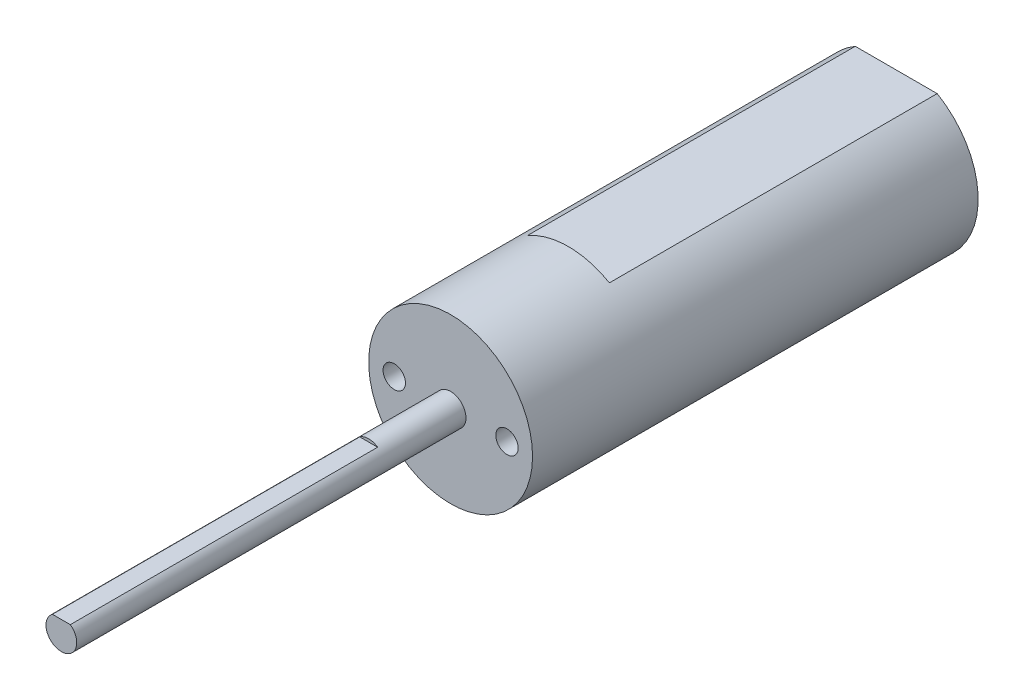
ISO-10303-21;
HEADER;
FILE_DESCRIPTION(('STEP AP214'),'2;1');
FILE_NAME('part.step','',(''),(''),'','','');
FILE_SCHEMA(('AUTOMOTIVE_DESIGN { 1 0 10303 214 1 1 1 1 }'));
ENDSEC;
DATA;
#1=APPLICATION_CONTEXT('core data for automotive mechanical design processes');
#2=APPLICATION_PROTOCOL_DEFINITION('international standard','automotive_design',2000,#1);
#3=PRODUCT_CONTEXT('',#1,'mechanical');
#4=PRODUCT('Part','Part','',(#3));
#5=PRODUCT_RELATED_PRODUCT_CATEGORY('part','',(#4));
#6=PRODUCT_DEFINITION_FORMATION('','',#4);
#7=PRODUCT_DEFINITION_CONTEXT('part definition',#1,'design');
#8=PRODUCT_DEFINITION('design','',#6,#7);
#9=PRODUCT_DEFINITION_SHAPE('','',#8);
#10=(LENGTH_UNIT() NAMED_UNIT(*) SI_UNIT(.MILLI.,.METRE.));
#11=(NAMED_UNIT(*) PLANE_ANGLE_UNIT() SI_UNIT($,.RADIAN.));
#12=(NAMED_UNIT(*) SI_UNIT($,.STERADIAN.) SOLID_ANGLE_UNIT());
#13=UNCERTAINTY_MEASURE_WITH_UNIT(LENGTH_MEASURE(1.E-05),#10,'distance_accuracy_value','');
#14=(GEOMETRIC_REPRESENTATION_CONTEXT(3) GLOBAL_UNCERTAINTY_ASSIGNED_CONTEXT((#13)) GLOBAL_UNIT_ASSIGNED_CONTEXT((#10,
#11,#12)) REPRESENTATION_CONTEXT('',''));
#15=CARTESIAN_POINT('',(0.,0.,0.));
#16=DIRECTION('',(0.,0.,1.));
#17=DIRECTION('',(1.,0.,0.));
#18=AXIS2_PLACEMENT_3D('',#15,#16,#17);
#19=CARTESIAN_POINT('',(0.,0.,81.5));
#20=DIRECTION('',(0.,0.,-1.));
#21=DIRECTION('',(-1.,0.,0.));
#22=AXIS2_PLACEMENT_3D('',#19,#20,#21);
#23=CYLINDRICAL_SURFACE('',#22,1.5);
#24=CARTESIAN_POINT('',(0.,0.,43.5));
#25=DIRECTION('',(0.,0.,1.));
#26=DIRECTION('',(1.,0.,0.));
#27=AXIS2_PLACEMENT_3D('',#24,#25,#26);
#28=CIRCLE('',#27,1.5);
#29=CARTESIAN_POINT('',(1.5,0.,43.5));
#30=VERTEX_POINT('',#29);
#31=EDGE_CURVE('E116',#30,#30,#28,.T.);
#32=ORIENTED_EDGE('',*,*,#31,.T.);
#33=EDGE_LOOP('',(#32));
#34=FACE_BOUND('',#33,.T.);
#35=DIRECTION('',(0.,0.,1.));
#36=VECTOR('',#35,1.);
#37=CARTESIAN_POINT('',(0.875,1.21834929310112,51.5));
#38=LINE('',#37,#36);
#39=CARTESIAN_POINT('',(0.875,1.21834929310112,51.5));
#40=VERTEX_POINT('',#39);
#41=CARTESIAN_POINT('',(0.875,1.21834929310112,81.5));
#42=VERTEX_POINT('',#41);
#43=EDGE_CURVE('E93',#40,#42,#38,.T.);
#44=ORIENTED_EDGE('',*,*,#43,.T.);
#45=CARTESIAN_POINT('',(0.,0.,81.5));
#46=DIRECTION('',(0.,0.,1.));
#47=DIRECTION('',(1.,0.,0.));
#48=AXIS2_PLACEMENT_3D('',#45,#46,#47);
#49=CIRCLE('',#48,1.5);
#50=CARTESIAN_POINT('',(-0.875,1.21834929310112,81.5));
#51=VERTEX_POINT('',#50);
#52=EDGE_CURVE('E118',#51,#42,#49,.T.);
#53=ORIENTED_EDGE('',*,*,#52,.F.);
#54=DIRECTION('',(0.,0.,1.));
#55=VECTOR('',#54,1.);
#56=CARTESIAN_POINT('',(-0.875,1.21834929310112,51.5));
#57=LINE('',#56,#55);
#58=CARTESIAN_POINT('',(-0.875,1.21834929310112,51.5));
#59=VERTEX_POINT('',#58);
#60=EDGE_CURVE('E57',#59,#51,#57,.T.);
#61=ORIENTED_EDGE('',*,*,#60,.F.);
#62=CARTESIAN_POINT('',(0.,0.,51.5));
#63=DIRECTION('',(0.,0.,1.));
#64=DIRECTION('',(1.,0.,0.));
#65=AXIS2_PLACEMENT_3D('',#62,#63,#64);
#66=CIRCLE('',#65,1.5);
#67=EDGE_CURVE('E104',#40,#59,#66,.T.);
#68=ORIENTED_EDGE('',*,*,#67,.F.);
#69=EDGE_LOOP('',(#44,#53,#61,#68));
#70=FACE_BOUND('',#69,.T.);
#71=ADVANCED_FACE('F41',(#34,#70),#23,.T.);
#72=CARTESIAN_POINT('',(0.,0.,81.5));
#73=DIRECTION('',(0.,0.,1.));
#74=DIRECTION('',(1.,0.,0.));
#75=AXIS2_PLACEMENT_3D('',#72,#73,#74);
#76=PLANE('',#75);
#77=ORIENTED_EDGE('',*,*,#52,.T.);
#78=DIRECTION('',(-1.,0.,0.));
#79=VECTOR('',#78,1.);
#80=CARTESIAN_POINT('',(0.,1.21834929310112,81.5));
#81=LINE('',#80,#79);
#82=EDGE_CURVE('E98',#42,#51,#81,.T.);
#83=ORIENTED_EDGE('',*,*,#82,.T.);
#84=EDGE_LOOP('',(#77,#83));
#85=FACE_BOUND('',#84,.T.);
#86=ADVANCED_FACE('F204',(#85),#76,.T.);
#87=CARTESIAN_POINT('',(0.,0.,32.));
#88=DIRECTION('',(0.,0.,-1.));
#89=DIRECTION('',(-1.,0.,0.));
#90=AXIS2_PLACEMENT_3D('',#87,#88,#89);
#91=CYLINDRICAL_SURFACE('',#90,8.);
#92=CARTESIAN_POINT('',(0.,0.,0.));
#93=DIRECTION('',(0.,0.,1.));
#94=DIRECTION('',(1.,0.,0.));
#95=AXIS2_PLACEMENT_3D('',#92,#93,#94);
#96=CIRCLE('',#95,8.);
#97=CARTESIAN_POINT('',(4.,-6.92820323027551,0.));
#98=VERTEX_POINT('',#97);
#99=CARTESIAN_POINT('',(4.,6.92820323027551,0.));
#100=VERTEX_POINT('',#99);
#101=EDGE_CURVE('E45',#98,#100,#96,.T.);
#102=ORIENTED_EDGE('',*,*,#101,.T.);
#103=DIRECTION('',(0.,0.,-1.));
#104=VECTOR('',#103,1.);
#105=CARTESIAN_POINT('',(4.,6.92820323027551,32.));
#106=LINE('',#105,#104);
#107=CARTESIAN_POINT('',(4.,6.92820323027551,32.));
#108=VERTEX_POINT('',#107);
#109=EDGE_CURVE('E154',#108,#100,#106,.T.);
#110=ORIENTED_EDGE('',*,*,#109,.F.);
#111=CARTESIAN_POINT('',(0.,0.,32.));
#112=DIRECTION('',(0.,0.,1.));
#113=DIRECTION('',(1.,0.,0.));
#114=AXIS2_PLACEMENT_3D('',#111,#112,#113);
#115=CIRCLE('',#114,8.);
#116=CARTESIAN_POINT('',(-4.,6.92820323027551,32.));
#117=VERTEX_POINT('',#116);
#118=EDGE_CURVE('E146',#108,#117,#115,.T.);
#119=ORIENTED_EDGE('',*,*,#118,.T.);
#120=DIRECTION('',(0.,0.,-1.));
#121=VECTOR('',#120,1.);
#122=CARTESIAN_POINT('',(-4.,6.92820323027551,32.));
#123=LINE('',#122,#121);
#124=CARTESIAN_POINT('',(-4.,6.92820323027551,0.));
#125=VERTEX_POINT('',#124);
#126=EDGE_CURVE('E159',#117,#125,#123,.T.);
#127=ORIENTED_EDGE('',*,*,#126,.T.);
#128=CARTESIAN_POINT('',(-4.,-6.92820323027551,0.));
#129=VERTEX_POINT('',#128);
#130=EDGE_CURVE('E11',#125,#129,#96,.T.);
#131=ORIENTED_EDGE('',*,*,#130,.T.);
#132=DIRECTION('',(0.,0.,-1.));
#133=VECTOR('',#132,1.);
#134=CARTESIAN_POINT('',(-4.,-6.92820323027551,32.));
#135=LINE('',#134,#133);
#136=CARTESIAN_POINT('',(-4.,-6.92820323027551,32.));
#137=VERTEX_POINT('',#136);
#138=EDGE_CURVE('E65',#137,#129,#135,.T.);
#139=ORIENTED_EDGE('',*,*,#138,.F.);
#140=CARTESIAN_POINT('',(4.,-6.92820323027551,32.));
#141=VERTEX_POINT('',#140);
#142=EDGE_CURVE('E129',#137,#141,#115,.T.);
#143=ORIENTED_EDGE('',*,*,#142,.T.);
#144=DIRECTION('',(0.,0.,-1.));
#145=VECTOR('',#144,1.);
#146=CARTESIAN_POINT('',(4.,-6.92820323027551,32.));
#147=LINE('',#146,#145);
#148=EDGE_CURVE('E158',#141,#98,#147,.T.);
#149=ORIENTED_EDGE('',*,*,#148,.T.);
#150=EDGE_LOOP('',(#102,#110,#119,#127,#131,#139,#143,#149));
#151=FACE_BOUND('',#150,.T.);
#152=CARTESIAN_POINT('',(0.,0.,43.5));
#153=DIRECTION('',(0.,0.,1.));
#154=DIRECTION('',(1.,0.,0.));
#155=AXIS2_PLACEMENT_3D('',#152,#153,#154);
#156=CIRCLE('',#155,8.);
#157=CARTESIAN_POINT('',(8.,0.,43.5));
#158=VERTEX_POINT('',#157);
#159=EDGE_CURVE('E141',#158,#158,#156,.T.);
#160=ORIENTED_EDGE('',*,*,#159,.F.);
#161=EDGE_LOOP('',(#160));
#162=FACE_BOUND('',#161,.T.);
#163=ADVANCED_FACE('F43',(#151,#162),#91,.T.);
#164=CARTESIAN_POINT('',(0.,0.,0.));
#165=DIRECTION('',(0.,0.,1.));
#166=DIRECTION('',(1.,0.,0.));
#167=AXIS2_PLACEMENT_3D('',#164,#165,#166);
#168=PLANE('',#167);
#169=ORIENTED_EDGE('',*,*,#130,.F.);
#170=DIRECTION('',(-1.,0.,0.));
#171=VECTOR('',#170,1.);
#172=CARTESIAN_POINT('',(0.,6.92820323027551,0.));
#173=LINE('',#172,#171);
#174=EDGE_CURVE('E155',#100,#125,#173,.T.);
#175=ORIENTED_EDGE('',*,*,#174,.F.);
#176=ORIENTED_EDGE('',*,*,#101,.F.);
#177=DIRECTION('',(1.,0.,0.));
#178=VECTOR('',#177,1.);
#179=CARTESIAN_POINT('',(0.,-6.92820323027551,0.));
#180=LINE('',#179,#178);
#181=EDGE_CURVE('E145',#129,#98,#180,.T.);
#182=ORIENTED_EDGE('',*,*,#181,.F.);
#183=EDGE_LOOP('',(#169,#175,#176,#182));
#184=FACE_BOUND('',#183,.T.);
#185=ADVANCED_FACE('F186',(#184),#168,.F.);
#186=CARTESIAN_POINT('',(0.,-6.92820323027551,32.));
#187=DIRECTION('',(0.,1.,0.));
#188=DIRECTION('',(0.,0.,1.));
#189=AXIS2_PLACEMENT_3D('',#186,#187,#188);
#190=PLANE('',#189);
#191=ORIENTED_EDGE('',*,*,#181,.T.);
#192=ORIENTED_EDGE('',*,*,#148,.F.);
#193=DIRECTION('',(1.,0.,0.));
#194=VECTOR('',#193,1.);
#195=CARTESIAN_POINT('',(0.,-6.92820323027551,32.));
#196=LINE('',#195,#194);
#197=EDGE_CURVE('E165',#137,#141,#196,.T.);
#198=ORIENTED_EDGE('',*,*,#197,.F.);
#199=ORIENTED_EDGE('',*,*,#138,.T.);
#200=EDGE_LOOP('',(#191,#192,#198,#199));
#201=FACE_BOUND('',#200,.T.);
#202=ADVANCED_FACE('F183',(#201),#190,.F.);
#203=CARTESIAN_POINT('',(0.,6.92820323027551,32.));
#204=DIRECTION('',(0.,-1.,0.));
#205=DIRECTION('',(0.,0.,-1.));
#206=AXIS2_PLACEMENT_3D('',#203,#204,#205);
#207=PLANE('',#206);
#208=ORIENTED_EDGE('',*,*,#174,.T.);
#209=ORIENTED_EDGE('',*,*,#126,.F.);
#210=DIRECTION('',(-1.,0.,0.));
#211=VECTOR('',#210,1.);
#212=CARTESIAN_POINT('',(0.,6.92820323027551,32.));
#213=LINE('',#212,#211);
#214=EDGE_CURVE('E150',#108,#117,#213,.T.);
#215=ORIENTED_EDGE('',*,*,#214,.F.);
#216=ORIENTED_EDGE('',*,*,#109,.T.);
#217=EDGE_LOOP('',(#208,#209,#215,#216));
#218=FACE_BOUND('',#217,.T.);
#219=ADVANCED_FACE('F191',(#218),#207,.F.);
#220=CARTESIAN_POINT('',(0.,0.,32.));
#221=DIRECTION('',(0.,0.,1.));
#222=DIRECTION('',(1.,0.,0.));
#223=AXIS2_PLACEMENT_3D('',#220,#221,#222);
#224=PLANE('',#223);
#225=ORIENTED_EDGE('',*,*,#118,.F.);
#226=ORIENTED_EDGE('',*,*,#214,.T.);
#227=EDGE_LOOP('',(#225,#226));
#228=FACE_BOUND('',#227,.T.);
#229=ADVANCED_FACE('F193',(#228),#224,.F.);
#230=ORIENTED_EDGE('',*,*,#142,.F.);
#231=ORIENTED_EDGE('',*,*,#197,.T.);
#232=EDGE_LOOP('',(#230,#231));
#233=FACE_BOUND('',#232,.T.);
#234=ADVANCED_FACE('F182',(#233),#224,.F.);
#235=CARTESIAN_POINT('',(0.,0.,43.5));
#236=DIRECTION('',(0.,0.,1.));
#237=DIRECTION('',(1.,0.,0.));
#238=AXIS2_PLACEMENT_3D('',#235,#236,#237);
#239=PLANE('',#238);
#240=ORIENTED_EDGE('',*,*,#31,.F.);
#241=EDGE_LOOP('',(#240));
#242=FACE_BOUND('',#241,.T.);
#243=CARTESIAN_POINT('',(5.5,0.,43.5));
#244=DIRECTION('',(0.,0.,1.));
#245=DIRECTION('',(1.,0.,0.));
#246=AXIS2_PLACEMENT_3D('',#243,#244,#245);
#247=CIRCLE('',#246,1.0922);
#248=CARTESIAN_POINT('',(6.5922,0.,43.5));
#249=VERTEX_POINT('',#248);
#250=EDGE_CURVE('E130',#249,#249,#247,.T.);
#251=ORIENTED_EDGE('',*,*,#250,.F.);
#252=EDGE_LOOP('',(#251));
#253=FACE_BOUND('',#252,.T.);
#254=CARTESIAN_POINT('',(-5.5,0.,43.5));
#255=DIRECTION('',(0.,0.,1.));
#256=DIRECTION('',(1.,0.,0.));
#257=AXIS2_PLACEMENT_3D('',#254,#255,#256);
#258=CIRCLE('',#257,1.0922);
#259=CARTESIAN_POINT('',(-4.4078,0.,43.5));
#260=VERTEX_POINT('',#259);
#261=EDGE_CURVE('E134',#260,#260,#258,.T.);
#262=ORIENTED_EDGE('',*,*,#261,.F.);
#263=EDGE_LOOP('',(#262));
#264=FACE_BOUND('',#263,.T.);
#265=ORIENTED_EDGE('',*,*,#159,.T.);
#266=EDGE_LOOP('',(#265));
#267=FACE_BOUND('',#266,.T.);
#268=ADVANCED_FACE('F200',(#242,#253,#264,#267),#239,.T.);
#269=CARTESIAN_POINT('',(-5.5,0.,37.5));
#270=DIRECTION('',(0.,0.,1.));
#271=DIRECTION('',(1.,0.,0.));
#272=AXIS2_PLACEMENT_3D('',#269,#270,#271);
#273=CYLINDRICAL_SURFACE('',#272,1.0922);
#274=CARTESIAN_POINT('',(-5.5,0.,37.5));
#275=DIRECTION('',(0.,0.,1.));
#276=DIRECTION('',(1.,0.,0.));
#277=AXIS2_PLACEMENT_3D('',#274,#275,#276);
#278=CIRCLE('',#277,1.0922);
#279=CARTESIAN_POINT('',(-4.4078,0.,37.5));
#280=VERTEX_POINT('',#279);
#281=EDGE_CURVE('E121',#280,#280,#278,.T.);
#282=ORIENTED_EDGE('',*,*,#281,.F.);
#283=EDGE_LOOP('',(#282));
#284=FACE_BOUND('',#283,.T.);
#285=ORIENTED_EDGE('',*,*,#261,.T.);
#286=EDGE_LOOP('',(#285));
#287=FACE_BOUND('',#286,.T.);
#288=ADVANCED_FACE('F223',(#284,#287),#273,.F.);
#289=CARTESIAN_POINT('',(-5.5,0.,37.5));
#290=DIRECTION('',(0.,0.,1.));
#291=DIRECTION('',(1.,0.,0.));
#292=AXIS2_PLACEMENT_3D('',#289,#290,#291);
#293=PLANE('',#292);
#294=ORIENTED_EDGE('',*,*,#281,.T.);
#295=EDGE_LOOP('',(#294));
#296=FACE_BOUND('',#295,.T.);
#297=ADVANCED_FACE('F221',(#296),#293,.T.);
#298=CARTESIAN_POINT('',(5.5,0.,37.5));
#299=DIRECTION('',(0.,0.,1.));
#300=DIRECTION('',(1.,0.,0.));
#301=AXIS2_PLACEMENT_3D('',#298,#299,#300);
#302=CYLINDRICAL_SURFACE('',#301,1.0922);
#303=CARTESIAN_POINT('',(5.5,0.,37.5));
#304=DIRECTION('',(0.,0.,1.));
#305=DIRECTION('',(1.,0.,0.));
#306=AXIS2_PLACEMENT_3D('',#303,#304,#305);
#307=CIRCLE('',#306,1.0922);
#308=CARTESIAN_POINT('',(6.5922,0.,37.5));
#309=VERTEX_POINT('',#308);
#310=EDGE_CURVE('E125',#309,#309,#307,.T.);
#311=ORIENTED_EDGE('',*,*,#310,.F.);
#312=EDGE_LOOP('',(#311));
#313=FACE_BOUND('',#312,.T.);
#314=ORIENTED_EDGE('',*,*,#250,.T.);
#315=EDGE_LOOP('',(#314));
#316=FACE_BOUND('',#315,.T.);
#317=ADVANCED_FACE('F217',(#313,#316),#302,.F.);
#318=CARTESIAN_POINT('',(5.5,0.,37.5));
#319=DIRECTION('',(0.,0.,1.));
#320=DIRECTION('',(1.,0.,0.));
#321=AXIS2_PLACEMENT_3D('',#318,#319,#320);
#322=PLANE('',#321);
#323=ORIENTED_EDGE('',*,*,#310,.T.);
#324=EDGE_LOOP('',(#323));
#325=FACE_BOUND('',#324,.T.);
#326=ADVANCED_FACE('F214',(#325),#322,.T.);
#327=CARTESIAN_POINT('',(0.,1.21834929310112,51.5));
#328=DIRECTION('',(0.,1.,0.));
#329=DIRECTION('',(0.,0.,1.));
#330=AXIS2_PLACEMENT_3D('',#327,#328,#329);
#331=PLANE('',#330);
#332=ORIENTED_EDGE('',*,*,#82,.F.);
#333=ORIENTED_EDGE('',*,*,#43,.F.);
#334=DIRECTION('',(-1.,0.,0.));
#335=VECTOR('',#334,1.);
#336=CARTESIAN_POINT('',(0.,1.21834929310112,51.5));
#337=LINE('',#336,#335);
#338=EDGE_CURVE('E96',#40,#59,#337,.T.);
#339=ORIENTED_EDGE('',*,*,#338,.T.);
#340=ORIENTED_EDGE('',*,*,#60,.T.);
#341=EDGE_LOOP('',(#332,#333,#339,#340));
#342=FACE_BOUND('',#341,.T.);
#343=ADVANCED_FACE('F95',(#342),#331,.T.);
#344=CARTESIAN_POINT('',(0.,0.,51.5));
#345=DIRECTION('',(0.,0.,1.));
#346=DIRECTION('',(1.,0.,0.));
#347=AXIS2_PLACEMENT_3D('',#344,#345,#346);
#348=PLANE('',#347);
#349=ORIENTED_EDGE('',*,*,#338,.F.);
#350=ORIENTED_EDGE('',*,*,#67,.T.);
#351=EDGE_LOOP('',(#349,#350));
#352=FACE_BOUND('',#351,.T.);
#353=ADVANCED_FACE('F107',(#352),#348,.T.);
#354=CLOSED_SHELL('',(#71,#86,#163,#185,#202,#219,#229,#234,#268,#288,#297,#317,#326,#343,#353));
#355=MANIFOLD_SOLID_BREP('B2',#354);
#356=ADVANCED_BREP_SHAPE_REPRESENTATION('',(#18,#355),#14);
#357=SHAPE_DEFINITION_REPRESENTATION(#9,#356);
ENDSEC;
END-ISO-10303-21;
